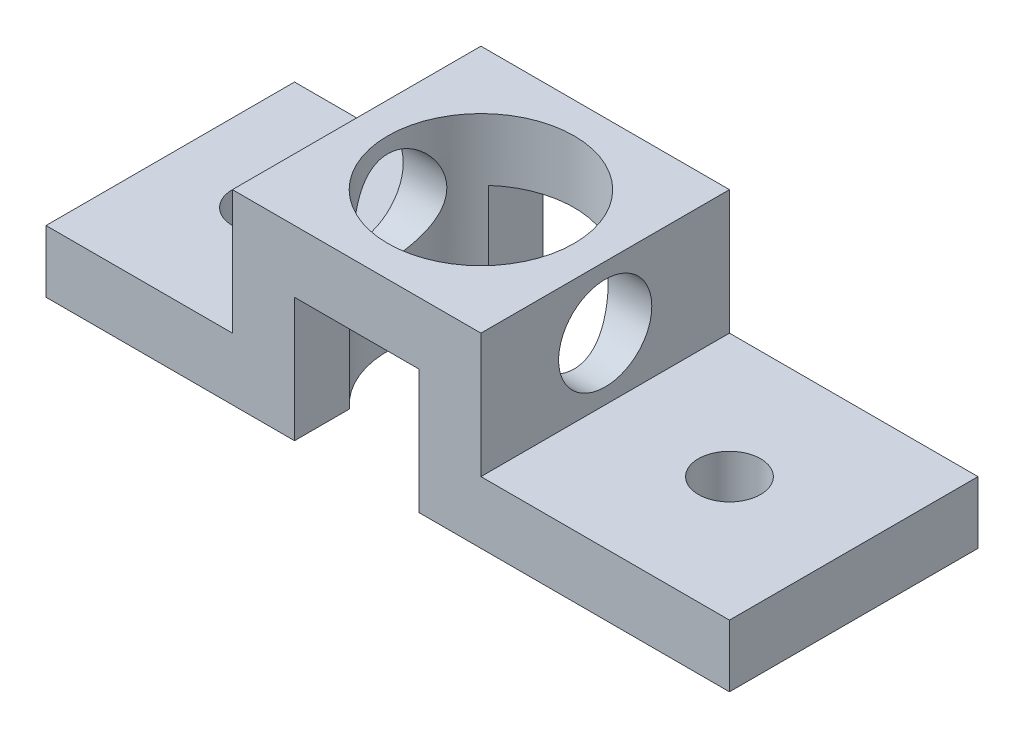
ISO-10303-21;
HEADER;
FILE_DESCRIPTION(('STEP AP214'),'2;1');
FILE_NAME('part.step','',(''),(''),'','','');
FILE_SCHEMA(('AUTOMOTIVE_DESIGN { 1 0 10303 214 1 1 1 1 }'));
ENDSEC;
DATA;
#1=APPLICATION_CONTEXT('core data for automotive mechanical design processes');
#2=APPLICATION_PROTOCOL_DEFINITION('international standard','automotive_design',2000,#1);
#3=PRODUCT_CONTEXT('',#1,'mechanical');
#4=PRODUCT('Part','Part','',(#3));
#5=PRODUCT_RELATED_PRODUCT_CATEGORY('part','',(#4));
#6=PRODUCT_DEFINITION_FORMATION('','',#4);
#7=PRODUCT_DEFINITION_CONTEXT('part definition',#1,'design');
#8=PRODUCT_DEFINITION('design','',#6,#7);
#9=PRODUCT_DEFINITION_SHAPE('','',#8);
#10=(LENGTH_UNIT() NAMED_UNIT(*) SI_UNIT(.MILLI.,.METRE.));
#11=(NAMED_UNIT(*) PLANE_ANGLE_UNIT() SI_UNIT($,.RADIAN.));
#12=(NAMED_UNIT(*) SI_UNIT($,.STERADIAN.) SOLID_ANGLE_UNIT());
#13=UNCERTAINTY_MEASURE_WITH_UNIT(LENGTH_MEASURE(1.E-05),#10,'distance_accuracy_value','');
#14=(GEOMETRIC_REPRESENTATION_CONTEXT(3) GLOBAL_UNCERTAINTY_ASSIGNED_CONTEXT((#13)) GLOBAL_UNIT_ASSIGNED_CONTEXT((#10,
#11,#12)) REPRESENTATION_CONTEXT('',''));
#15=CARTESIAN_POINT('',(0.,0.,0.));
#16=DIRECTION('',(0.,0.,1.));
#17=DIRECTION('',(1.,0.,0.));
#18=AXIS2_PLACEMENT_3D('',#15,#16,#17);
#19=CARTESIAN_POINT('',(25.4,12.7,25.4));
#20=DIRECTION('',(0.,1.,0.));
#21=DIRECTION('',(0.,0.,1.));
#22=AXIS2_PLACEMENT_3D('',#19,#20,#21);
#23=PLANE('',#22);
#24=DIRECTION('',(0.,0.,-1.));
#25=VECTOR('',#24,1.);
#26=CARTESIAN_POINT('',(38.1,12.7,25.4));
#27=LINE('',#26,#25);
#28=CARTESIAN_POINT('',(38.1,12.7,5.60048417143819));
#29=VERTEX_POINT('',#28);
#30=CARTESIAN_POINT('',(38.1,12.7,0.));
#31=VERTEX_POINT('',#30);
#32=EDGE_CURVE('E247',#29,#31,#27,.T.);
#33=ORIENTED_EDGE('',*,*,#32,.F.);
#34=CARTESIAN_POINT('',(31.75,12.7,12.7));
#35=DIRECTION('',(0.,1.,0.));
#36=DIRECTION('',(0.,0.,1.));
#37=AXIS2_PLACEMENT_3D('',#34,#35,#36);
#38=CIRCLE('',#37,9.52499999999998);
#39=CARTESIAN_POINT('',(25.4,12.7,5.60048417143818));
#40=VERTEX_POINT('',#39);
#41=EDGE_CURVE('E336',#29,#40,#38,.T.);
#42=ORIENTED_EDGE('',*,*,#41,.T.);
#43=DIRECTION('',(0.,0.,-1.));
#44=VECTOR('',#43,1.);
#45=CARTESIAN_POINT('',(25.4,12.7,25.4));
#46=LINE('',#45,#44);
#47=CARTESIAN_POINT('',(25.4,12.7,0.));
#48=VERTEX_POINT('',#47);
#49=EDGE_CURVE('E252',#40,#48,#46,.T.);
#50=ORIENTED_EDGE('',*,*,#49,.T.);
#51=DIRECTION('',(1.,0.,0.));
#52=VECTOR('',#51,1.);
#53=CARTESIAN_POINT('',(25.4,12.7,0.));
#54=LINE('',#53,#52);
#55=EDGE_CURVE('E196',#48,#31,#54,.T.);
#56=ORIENTED_EDGE('',*,*,#55,.T.);
#57=EDGE_LOOP('',(#33,#42,#50,#56));
#58=FACE_BOUND('',#57,.T.);
#59=ADVANCED_FACE('F39',(#58),#23,.F.);
#60=CARTESIAN_POINT('',(25.4,0.,25.4));
#61=DIRECTION('',(-1.,0.,0.));
#62=DIRECTION('',(0.,0.,1.));
#63=AXIS2_PLACEMENT_3D('',#60,#61,#62);
#64=PLANE('',#63);
#65=DIRECTION('',(0.,0.,-1.));
#66=VECTOR('',#65,1.);
#67=CARTESIAN_POINT('',(25.4,0.,25.4));
#68=LINE('',#67,#66);
#69=CARTESIAN_POINT('',(25.4,0.,25.4));
#70=VERTEX_POINT('',#69);
#71=CARTESIAN_POINT('',(25.4,0.,19.7995158285618));
#72=VERTEX_POINT('',#71);
#73=EDGE_CURVE('E54',#70,#72,#68,.T.);
#74=ORIENTED_EDGE('',*,*,#73,.T.);
#75=DIRECTION('',(0.,1.,0.));
#76=VECTOR('',#75,1.);
#77=CARTESIAN_POINT('',(25.4,19.05,19.7995158285618));
#78=LINE('',#77,#76);
#79=CARTESIAN_POINT('',(25.4,12.7,19.7995158285618));
#80=VERTEX_POINT('',#79);
#81=EDGE_CURVE('E188',#72,#80,#78,.T.);
#82=ORIENTED_EDGE('',*,*,#81,.T.);
#83=CARTESIAN_POINT('',(25.4,12.7,25.4));
#84=VERTEX_POINT('',#83);
#85=EDGE_CURVE('E253',#84,#80,#46,.T.);
#86=ORIENTED_EDGE('',*,*,#85,.F.);
#87=DIRECTION('',(0.,1.,0.));
#88=VECTOR('',#87,1.);
#89=CARTESIAN_POINT('',(25.4,0.,25.4));
#90=LINE('',#89,#88);
#91=EDGE_CURVE('E326',#70,#84,#90,.T.);
#92=ORIENTED_EDGE('',*,*,#91,.F.);
#93=EDGE_LOOP('',(#74,#82,#86,#92));
#94=FACE_BOUND('',#93,.T.);
#95=ADVANCED_FACE('F292',(#94),#64,.F.);
#96=CARTESIAN_POINT('',(38.1,12.7,25.4));
#97=DIRECTION('',(1.,0.,0.));
#98=DIRECTION('',(0.,0.,-1.));
#99=AXIS2_PLACEMENT_3D('',#96,#97,#98);
#100=PLANE('',#99);
#101=DIRECTION('',(0.,0.,-1.));
#102=VECTOR('',#101,1.);
#103=CARTESIAN_POINT('',(38.1,0.,25.4));
#104=LINE('',#103,#102);
#105=CARTESIAN_POINT('',(38.1,0.,5.60048417143819));
#106=VERTEX_POINT('',#105);
#107=CARTESIAN_POINT('',(38.1,0.,0.));
#108=VERTEX_POINT('',#107);
#109=EDGE_CURVE('E242',#106,#108,#104,.T.);
#110=ORIENTED_EDGE('',*,*,#109,.F.);
#111=DIRECTION('',(0.,1.,0.));
#112=VECTOR('',#111,1.);
#113=CARTESIAN_POINT('',(38.1,19.05,5.60048417143819));
#114=LINE('',#113,#112);
#115=EDGE_CURVE('E62',#106,#29,#114,.T.);
#116=ORIENTED_EDGE('',*,*,#115,.T.);
#117=ORIENTED_EDGE('',*,*,#32,.T.);
#118=DIRECTION('',(0.,-1.,0.));
#119=VECTOR('',#118,1.);
#120=CARTESIAN_POINT('',(38.1,12.7,0.));
#121=LINE('',#120,#119);
#122=EDGE_CURVE('E200',#31,#108,#121,.T.);
#123=ORIENTED_EDGE('',*,*,#122,.T.);
#124=EDGE_LOOP('',(#110,#116,#117,#123));
#125=FACE_BOUND('',#124,.T.);
#126=ADVANCED_FACE('F299',(#125),#100,.F.);
#127=CARTESIAN_POINT('',(0.,6.34999999999999,25.4));
#128=DIRECTION('',(1.,0.,0.));
#129=DIRECTION('',(0.,0.,-1.));
#130=AXIS2_PLACEMENT_3D('',#127,#128,#129);
#131=PLANE('',#130);
#132=DIRECTION('',(0.,-1.,0.));
#133=VECTOR('',#132,1.);
#134=CARTESIAN_POINT('',(0.,6.34999999999999,0.));
#135=LINE('',#134,#133);
#136=CARTESIAN_POINT('',(0.,6.34999999999999,0.));
#137=VERTEX_POINT('',#136);
#138=CARTESIAN_POINT('',(0.,0.,0.));
#139=VERTEX_POINT('',#138);
#140=EDGE_CURVE('E183',#137,#139,#135,.T.);
#141=ORIENTED_EDGE('',*,*,#140,.T.);
#142=DIRECTION('',(0.,0.,-1.));
#143=VECTOR('',#142,1.);
#144=CARTESIAN_POINT('',(0.,0.,25.4));
#145=LINE('',#144,#143);
#146=CARTESIAN_POINT('',(0.,0.,25.4));
#147=VERTEX_POINT('',#146);
#148=EDGE_CURVE('E11',#147,#139,#145,.T.);
#149=ORIENTED_EDGE('',*,*,#148,.F.);
#150=DIRECTION('',(0.,-1.,0.));
#151=VECTOR('',#150,1.);
#152=CARTESIAN_POINT('',(0.,6.34999999999999,25.4));
#153=LINE('',#152,#151);
#154=CARTESIAN_POINT('',(0.,6.34999999999999,25.4));
#155=VERTEX_POINT('',#154);
#156=EDGE_CURVE('E223',#155,#147,#153,.T.);
#157=ORIENTED_EDGE('',*,*,#156,.F.);
#158=DIRECTION('',(0.,0.,-1.));
#159=VECTOR('',#158,1.);
#160=CARTESIAN_POINT('',(0.,6.34999999999999,25.4));
#161=LINE('',#160,#159);
#162=EDGE_CURVE('E179',#155,#137,#161,.T.);
#163=ORIENTED_EDGE('',*,*,#162,.T.);
#164=EDGE_LOOP('',(#141,#149,#157,#163));
#165=FACE_BOUND('',#164,.T.);
#166=ADVANCED_FACE('F41',(#165),#131,.F.);
#167=CARTESIAN_POINT('',(0.,0.,25.4));
#168=DIRECTION('',(0.,1.,0.));
#169=DIRECTION('',(0.,0.,1.));
#170=AXIS2_PLACEMENT_3D('',#167,#168,#169);
#171=PLANE('',#170);
#172=CARTESIAN_POINT('',(9.525,0.,12.7));
#173=DIRECTION('',(0.,1.,0.));
#174=DIRECTION('',(0.,0.,1.));
#175=AXIS2_PLACEMENT_3D('',#172,#173,#174);
#176=CIRCLE('',#175,3.175);
#177=CARTESIAN_POINT('',(9.525,0.,15.875));
#178=VERTEX_POINT('',#177);
#179=EDGE_CURVE('E391',#178,#178,#176,.T.);
#180=ORIENTED_EDGE('',*,*,#179,.T.);
#181=EDGE_LOOP('',(#180));
#182=FACE_BOUND('',#181,.T.);
#183=CARTESIAN_POINT('',(25.4,0.,5.60048417143818));
#184=VERTEX_POINT('',#183);
#185=CARTESIAN_POINT('',(25.4,0.,0.));
#186=VERTEX_POINT('',#185);
#187=EDGE_CURVE('E257',#184,#186,#68,.T.);
#188=ORIENTED_EDGE('',*,*,#187,.F.);
#189=CARTESIAN_POINT('',(31.75,0.,12.7));
#190=DIRECTION('',(0.,1.,0.));
#191=DIRECTION('',(0.,0.,1.));
#192=AXIS2_PLACEMENT_3D('',#189,#190,#191);
#193=CIRCLE('',#192,9.52499999999998);
#194=EDGE_CURVE('E377',#184,#72,#193,.T.);
#195=ORIENTED_EDGE('',*,*,#194,.T.);
#196=ORIENTED_EDGE('',*,*,#73,.F.);
#197=DIRECTION('',(1.,0.,0.));
#198=VECTOR('',#197,1.);
#199=CARTESIAN_POINT('',(0.,0.,25.4));
#200=LINE('',#199,#198);
#201=EDGE_CURVE('E124',#147,#70,#200,.T.);
#202=ORIENTED_EDGE('',*,*,#201,.F.);
#203=ORIENTED_EDGE('',*,*,#148,.T.);
#204=DIRECTION('',(1.,0.,0.));
#205=VECTOR('',#204,1.);
#206=CARTESIAN_POINT('',(0.,0.,0.));
#207=LINE('',#206,#205);
#208=EDGE_CURVE('E187',#139,#186,#207,.T.);
#209=ORIENTED_EDGE('',*,*,#208,.T.);
#210=EDGE_LOOP('',(#188,#195,#196,#202,#203,#209));
#211=FACE_BOUND('',#210,.T.);
#212=ADVANCED_FACE('F314',(#182,#211),#171,.F.);
#213=ORIENTED_EDGE('',*,*,#49,.F.);
#214=DIRECTION('',(0.,1.,0.));
#215=VECTOR('',#214,1.);
#216=CARTESIAN_POINT('',(25.4,19.05,5.60048417143818));
#217=LINE('',#216,#215);
#218=EDGE_CURVE('E389',#40,#184,#217,.F.);
#219=ORIENTED_EDGE('',*,*,#218,.T.);
#220=ORIENTED_EDGE('',*,*,#187,.T.);
#221=DIRECTION('',(0.,1.,0.));
#222=VECTOR('',#221,1.);
#223=CARTESIAN_POINT('',(25.4,0.,0.));
#224=LINE('',#223,#222);
#225=EDGE_CURVE('E192',#186,#48,#224,.T.);
#226=ORIENTED_EDGE('',*,*,#225,.T.);
#227=EDGE_LOOP('',(#213,#219,#220,#226));
#228=FACE_BOUND('',#227,.T.);
#229=ADVANCED_FACE('F302',(#228),#64,.F.);
#230=ORIENTED_EDGE('',*,*,#85,.T.);
#231=CARTESIAN_POINT('',(38.1,12.7,19.7995158285618));
#232=VERTEX_POINT('',#231);
#233=EDGE_CURVE('E322',#80,#232,#38,.T.);
#234=ORIENTED_EDGE('',*,*,#233,.T.);
#235=CARTESIAN_POINT('',(38.1,12.7,25.4));
#236=VERTEX_POINT('',#235);
#237=EDGE_CURVE('E248',#236,#232,#27,.T.);
#238=ORIENTED_EDGE('',*,*,#237,.F.);
#239=DIRECTION('',(1.,0.,0.));
#240=VECTOR('',#239,1.);
#241=CARTESIAN_POINT('',(25.4,12.7,25.4));
#242=LINE('',#241,#240);
#243=EDGE_CURVE('E323',#84,#236,#242,.T.);
#244=ORIENTED_EDGE('',*,*,#243,.F.);
#245=EDGE_LOOP('',(#230,#234,#238,#244));
#246=FACE_BOUND('',#245,.T.);
#247=ADVANCED_FACE('F295',(#246),#23,.F.);
#248=ORIENTED_EDGE('',*,*,#237,.T.);
#249=DIRECTION('',(0.,1.,0.));
#250=VECTOR('',#249,1.);
#251=CARTESIAN_POINT('',(38.1,19.05,19.7995158285618));
#252=LINE('',#251,#250);
#253=CARTESIAN_POINT('',(38.1,0.,19.7995158285618));
#254=VERTEX_POINT('',#253);
#255=EDGE_CURVE('E334',#232,#254,#252,.F.);
#256=ORIENTED_EDGE('',*,*,#255,.T.);
#257=CARTESIAN_POINT('',(38.1,0.,25.4));
#258=VERTEX_POINT('',#257);
#259=EDGE_CURVE('E243',#258,#254,#104,.T.);
#260=ORIENTED_EDGE('',*,*,#259,.F.);
#261=DIRECTION('',(0.,-1.,0.));
#262=VECTOR('',#261,1.);
#263=CARTESIAN_POINT('',(38.1,12.7,25.4));
#264=LINE('',#263,#262);
#265=EDGE_CURVE('E348',#236,#258,#264,.T.);
#266=ORIENTED_EDGE('',*,*,#265,.F.);
#267=EDGE_LOOP('',(#248,#256,#260,#266));
#268=FACE_BOUND('',#267,.T.);
#269=ADVANCED_FACE('F306',(#268),#100,.F.);
#270=CARTESIAN_POINT('',(38.1,0.,25.4));
#271=DIRECTION('',(0.,1.,0.));
#272=DIRECTION('',(0.,0.,1.));
#273=AXIS2_PLACEMENT_3D('',#270,#271,#272);
#274=PLANE('',#273);
#275=CARTESIAN_POINT('',(57.15,0.,12.7));
#276=DIRECTION('',(0.,1.,0.));
#277=DIRECTION('',(0.,0.,1.));
#278=AXIS2_PLACEMENT_3D('',#275,#276,#277);
#279=CIRCLE('',#278,3.175);
#280=CARTESIAN_POINT('',(57.15,0.,15.875));
#281=VERTEX_POINT('',#280);
#282=EDGE_CURVE('E587',#281,#281,#279,.T.);
#283=ORIENTED_EDGE('',*,*,#282,.T.);
#284=EDGE_LOOP('',(#283));
#285=FACE_BOUND('',#284,.T.);
#286=ORIENTED_EDGE('',*,*,#259,.T.);
#287=EDGE_CURVE('E384',#254,#106,#193,.T.);
#288=ORIENTED_EDGE('',*,*,#287,.T.);
#289=ORIENTED_EDGE('',*,*,#109,.T.);
#290=DIRECTION('',(1.,0.,0.));
#291=VECTOR('',#290,1.);
#292=CARTESIAN_POINT('',(38.1,0.,0.));
#293=LINE('',#292,#291);
#294=CARTESIAN_POINT('',(69.85,0.,0.));
#295=VERTEX_POINT('',#294);
#296=EDGE_CURVE('E204',#108,#295,#293,.T.);
#297=ORIENTED_EDGE('',*,*,#296,.T.);
#298=DIRECTION('',(0.,0.,-1.));
#299=VECTOR('',#298,1.);
#300=CARTESIAN_POINT('',(69.85,0.,25.4));
#301=LINE('',#300,#299);
#302=CARTESIAN_POINT('',(69.85,0.,25.4));
#303=VERTEX_POINT('',#302);
#304=EDGE_CURVE('E238',#303,#295,#301,.T.);
#305=ORIENTED_EDGE('',*,*,#304,.F.);
#306=DIRECTION('',(1.,0.,0.));
#307=VECTOR('',#306,1.);
#308=CARTESIAN_POINT('',(38.1,0.,25.4));
#309=LINE('',#308,#307);
#310=EDGE_CURVE('E351',#258,#303,#309,.T.);
#311=ORIENTED_EDGE('',*,*,#310,.F.);
#312=EDGE_LOOP('',(#286,#288,#289,#297,#305,#311));
#313=FACE_BOUND('',#312,.T.);
#314=ADVANCED_FACE('F312',(#285,#313),#274,.F.);
#315=CARTESIAN_POINT('',(69.85,0.,25.4));
#316=DIRECTION('',(-1.,0.,0.));
#317=DIRECTION('',(0.,0.,1.));
#318=AXIS2_PLACEMENT_3D('',#315,#316,#317);
#319=PLANE('',#318);
#320=DIRECTION('',(0.,1.,0.));
#321=VECTOR('',#320,1.);
#322=CARTESIAN_POINT('',(69.85,0.,0.));
#323=LINE('',#322,#321);
#324=CARTESIAN_POINT('',(69.85,6.35,0.));
#325=VERTEX_POINT('',#324);
#326=EDGE_CURVE('E207',#295,#325,#323,.T.);
#327=ORIENTED_EDGE('',*,*,#326,.T.);
#328=DIRECTION('',(0.,0.,-1.));
#329=VECTOR('',#328,1.);
#330=CARTESIAN_POINT('',(69.85,6.35,25.4));
#331=LINE('',#330,#329);
#332=CARTESIAN_POINT('',(69.85,6.35,25.4));
#333=VERTEX_POINT('',#332);
#334=EDGE_CURVE('E234',#333,#325,#331,.T.);
#335=ORIENTED_EDGE('',*,*,#334,.F.);
#336=DIRECTION('',(0.,1.,0.));
#337=VECTOR('',#336,1.);
#338=CARTESIAN_POINT('',(69.85,0.,25.4));
#339=LINE('',#338,#337);
#340=EDGE_CURVE('E354',#303,#333,#339,.T.);
#341=ORIENTED_EDGE('',*,*,#340,.F.);
#342=ORIENTED_EDGE('',*,*,#304,.T.);
#343=EDGE_LOOP('',(#327,#335,#341,#342));
#344=FACE_BOUND('',#343,.T.);
#345=ADVANCED_FACE('F415',(#344),#319,.F.);
#346=CARTESIAN_POINT('',(69.85,6.35,25.4));
#347=DIRECTION('',(0.,-1.,0.));
#348=DIRECTION('',(1.,0.,0.));
#349=AXIS2_PLACEMENT_3D('',#346,#347,#348);
#350=PLANE('',#349);
#351=CARTESIAN_POINT('',(57.15,6.35,12.7));
#352=DIRECTION('',(0.,1.,0.));
#353=DIRECTION('',(0.,0.,1.));
#354=AXIS2_PLACEMENT_3D('',#351,#352,#353);
#355=CIRCLE('',#354,3.17499999999998);
#356=CARTESIAN_POINT('',(57.15,6.35,15.875));
#357=VERTEX_POINT('',#356);
#358=EDGE_CURVE('E593',#357,#357,#355,.T.);
#359=ORIENTED_EDGE('',*,*,#358,.F.);
#360=EDGE_LOOP('',(#359));
#361=FACE_BOUND('',#360,.T.);
#362=DIRECTION('',(-1.,0.,0.));
#363=VECTOR('',#362,1.);
#364=CARTESIAN_POINT('',(69.85,6.35,0.));
#365=LINE('',#364,#363);
#366=CARTESIAN_POINT('',(44.45,6.35,0.));
#367=VERTEX_POINT('',#366);
#368=EDGE_CURVE('E210',#325,#367,#365,.T.);
#369=ORIENTED_EDGE('',*,*,#368,.T.);
#370=DIRECTION('',(0.,0.,-1.));
#371=VECTOR('',#370,1.);
#372=CARTESIAN_POINT('',(44.45,6.35,25.4));
#373=LINE('',#372,#371);
#374=CARTESIAN_POINT('',(44.45,6.35,25.4));
#375=VERTEX_POINT('',#374);
#376=EDGE_CURVE('E230',#375,#367,#373,.T.);
#377=ORIENTED_EDGE('',*,*,#376,.F.);
#378=DIRECTION('',(-1.,0.,0.));
#379=VECTOR('',#378,1.);
#380=CARTESIAN_POINT('',(69.85,6.35,25.4));
#381=LINE('',#380,#379);
#382=EDGE_CURVE('E357',#333,#375,#381,.T.);
#383=ORIENTED_EDGE('',*,*,#382,.F.);
#384=ORIENTED_EDGE('',*,*,#334,.T.);
#385=EDGE_LOOP('',(#369,#377,#383,#384));
#386=FACE_BOUND('',#385,.T.);
#387=ADVANCED_FACE('F365',(#361,#386),#350,.F.);
#388=CARTESIAN_POINT('',(44.45,6.35,25.4));
#389=DIRECTION('',(-1.,0.,0.));
#390=DIRECTION('',(0.,0.,1.));
#391=AXIS2_PLACEMENT_3D('',#388,#389,#390);
#392=PLANE('',#391);
#393=CARTESIAN_POINT('',(44.45,12.7,12.7));
#394=DIRECTION('',(1.,0.,0.));
#395=DIRECTION('',(0.,0.,-1.));
#396=AXIS2_PLACEMENT_3D('',#393,#394,#395);
#397=CIRCLE('',#396,4.7625);
#398=CARTESIAN_POINT('',(44.45,12.7,7.9375));
#399=VERTEX_POINT('',#398);
#400=EDGE_CURVE('E266',#399,#399,#397,.T.);
#401=ORIENTED_EDGE('',*,*,#400,.F.);
#402=EDGE_LOOP('',(#401));
#403=FACE_BOUND('',#402,.T.);
#404=DIRECTION('',(0.,1.,0.));
#405=VECTOR('',#404,1.);
#406=CARTESIAN_POINT('',(44.45,6.35,0.));
#407=LINE('',#406,#405);
#408=CARTESIAN_POINT('',(44.45,19.05,0.));
#409=VERTEX_POINT('',#408);
#410=EDGE_CURVE('E213',#367,#409,#407,.T.);
#411=ORIENTED_EDGE('',*,*,#410,.T.);
#412=DIRECTION('',(0.,0.,-1.));
#413=VECTOR('',#412,1.);
#414=CARTESIAN_POINT('',(44.45,19.05,25.4));
#415=LINE('',#414,#413);
#416=CARTESIAN_POINT('',(44.45,19.05,25.4));
#417=VERTEX_POINT('',#416);
#418=EDGE_CURVE('E172',#417,#409,#415,.T.);
#419=ORIENTED_EDGE('',*,*,#418,.F.);
#420=DIRECTION('',(0.,1.,0.));
#421=VECTOR('',#420,1.);
#422=CARTESIAN_POINT('',(44.45,6.35,25.4));
#423=LINE('',#422,#421);
#424=EDGE_CURVE('E158',#375,#417,#423,.T.);
#425=ORIENTED_EDGE('',*,*,#424,.F.);
#426=ORIENTED_EDGE('',*,*,#376,.T.);
#427=EDGE_LOOP('',(#411,#419,#425,#426));
#428=FACE_BOUND('',#427,.T.);
#429=ADVANCED_FACE('F369',(#403,#428),#392,.F.);
#430=CARTESIAN_POINT('',(44.45,19.05,25.4));
#431=DIRECTION('',(0.,-1.,0.));
#432=DIRECTION('',(1.,0.,0.));
#433=AXIS2_PLACEMENT_3D('',#430,#431,#432);
#434=PLANE('',#433);
#435=CARTESIAN_POINT('',(31.75,19.05,12.7));
#436=DIRECTION('',(0.,1.,0.));
#437=DIRECTION('',(0.,0.,1.));
#438=AXIS2_PLACEMENT_3D('',#435,#436,#437);
#439=CIRCLE('',#438,9.52499999999998);
#440=CARTESIAN_POINT('',(31.75,19.05,22.225));
#441=VERTEX_POINT('',#440);
#442=EDGE_CURVE('E385',#441,#441,#439,.T.);
#443=ORIENTED_EDGE('',*,*,#442,.F.);
#444=EDGE_LOOP('',(#443));
#445=FACE_BOUND('',#444,.T.);
#446=DIRECTION('',(-1.,0.,0.));
#447=VECTOR('',#446,1.);
#448=CARTESIAN_POINT('',(44.45,19.05,0.));
#449=LINE('',#448,#447);
#450=CARTESIAN_POINT('',(19.05,19.05,0.));
#451=VERTEX_POINT('',#450);
#452=EDGE_CURVE('E168',#409,#451,#449,.T.);
#453=ORIENTED_EDGE('',*,*,#452,.T.);
#454=DIRECTION('',(0.,0.,-1.));
#455=VECTOR('',#454,1.);
#456=CARTESIAN_POINT('',(19.05,19.05,25.4));
#457=LINE('',#456,#455);
#458=CARTESIAN_POINT('',(19.05,19.05,25.4));
#459=VERTEX_POINT('',#458);
#460=EDGE_CURVE('E165',#459,#451,#457,.T.);
#461=ORIENTED_EDGE('',*,*,#460,.F.);
#462=DIRECTION('',(-1.,0.,0.));
#463=VECTOR('',#462,1.);
#464=CARTESIAN_POINT('',(44.45,19.05,25.4));
#465=LINE('',#464,#463);
#466=EDGE_CURVE('E151',#417,#459,#465,.T.);
#467=ORIENTED_EDGE('',*,*,#466,.F.);
#468=ORIENTED_EDGE('',*,*,#418,.T.);
#469=EDGE_LOOP('',(#453,#461,#467,#468));
#470=FACE_BOUND('',#469,.T.);
#471=ADVANCED_FACE('F166',(#445,#470),#434,.F.);
#472=CARTESIAN_POINT('',(19.05,19.05,25.4));
#473=DIRECTION('',(1.,0.,0.));
#474=DIRECTION('',(0.,1.,0.));
#475=AXIS2_PLACEMENT_3D('',#472,#473,#474);
#476=PLANE('',#475);
#477=CARTESIAN_POINT('',(19.05,12.7,12.7));
#478=DIRECTION('',(1.,0.,0.));
#479=DIRECTION('',(0.,1.,0.));
#480=AXIS2_PLACEMENT_3D('',#477,#478,#479);
#481=CIRCLE('',#480,4.7625);
#482=CARTESIAN_POINT('',(19.05,17.4625,12.7));
#483=VERTEX_POINT('',#482);
#484=EDGE_CURVE('E597',#483,#483,#481,.T.);
#485=ORIENTED_EDGE('',*,*,#484,.T.);
#486=EDGE_LOOP('',(#485));
#487=FACE_BOUND('',#486,.T.);
#488=DIRECTION('',(0.,-1.,0.));
#489=VECTOR('',#488,1.);
#490=CARTESIAN_POINT('',(19.05,19.05,0.));
#491=LINE('',#490,#489);
#492=CARTESIAN_POINT('',(19.05,6.34999999999999,0.));
#493=VERTEX_POINT('',#492);
#494=EDGE_CURVE('E218',#451,#493,#491,.T.);
#495=ORIENTED_EDGE('',*,*,#494,.T.);
#496=DIRECTION('',(0.,0.,-1.));
#497=VECTOR('',#496,1.);
#498=CARTESIAN_POINT('',(19.05,6.34999999999999,25.4));
#499=LINE('',#498,#497);
#500=CARTESIAN_POINT('',(19.05,6.34999999999999,25.4));
#501=VERTEX_POINT('',#500);
#502=EDGE_CURVE('E173',#501,#493,#499,.T.);
#503=ORIENTED_EDGE('',*,*,#502,.F.);
#504=DIRECTION('',(0.,-1.,0.));
#505=VECTOR('',#504,1.);
#506=CARTESIAN_POINT('',(19.05,19.05,25.4));
#507=LINE('',#506,#505);
#508=EDGE_CURVE('E155',#459,#501,#507,.T.);
#509=ORIENTED_EDGE('',*,*,#508,.F.);
#510=ORIENTED_EDGE('',*,*,#460,.T.);
#511=EDGE_LOOP('',(#495,#503,#509,#510));
#512=FACE_BOUND('',#511,.T.);
#513=ADVANCED_FACE('F175',(#487,#512),#476,.F.);
#514=CARTESIAN_POINT('',(19.05,6.34999999999999,25.4));
#515=DIRECTION('',(0.,-1.,0.));
#516=DIRECTION('',(1.,0.,0.));
#517=AXIS2_PLACEMENT_3D('',#514,#515,#516);
#518=PLANE('',#517);
#519=CARTESIAN_POINT('',(9.525,6.34999999999999,12.7));
#520=DIRECTION('',(0.,1.,0.));
#521=DIRECTION('',(0.,0.,1.));
#522=AXIS2_PLACEMENT_3D('',#519,#520,#521);
#523=CIRCLE('',#522,3.175);
#524=CARTESIAN_POINT('',(9.525,6.34999999999999,15.875));
#525=VERTEX_POINT('',#524);
#526=EDGE_CURVE('E584',#525,#525,#523,.T.);
#527=ORIENTED_EDGE('',*,*,#526,.F.);
#528=EDGE_LOOP('',(#527));
#529=FACE_BOUND('',#528,.T.);
#530=DIRECTION('',(-1.,0.,0.));
#531=VECTOR('',#530,1.);
#532=CARTESIAN_POINT('',(19.05,6.34999999999999,0.));
#533=LINE('',#532,#531);
#534=EDGE_CURVE('E116',#493,#137,#533,.T.);
#535=ORIENTED_EDGE('',*,*,#534,.T.);
#536=ORIENTED_EDGE('',*,*,#162,.F.);
#537=DIRECTION('',(-1.,0.,0.));
#538=VECTOR('',#537,1.);
#539=CARTESIAN_POINT('',(19.05,6.34999999999999,25.4));
#540=LINE('',#539,#538);
#541=EDGE_CURVE('E71',#501,#155,#540,.T.);
#542=ORIENTED_EDGE('',*,*,#541,.F.);
#543=ORIENTED_EDGE('',*,*,#502,.T.);
#544=EDGE_LOOP('',(#535,#536,#542,#543));
#545=FACE_BOUND('',#544,.T.);
#546=ADVANCED_FACE('F372',(#529,#545),#518,.F.);
#547=CARTESIAN_POINT('',(0.,0.,25.4));
#548=DIRECTION('',(0.,0.,1.));
#549=DIRECTION('',(1.,0.,0.));
#550=AXIS2_PLACEMENT_3D('',#547,#548,#549);
#551=PLANE('',#550);
#552=ORIENTED_EDGE('',*,*,#156,.T.);
#553=ORIENTED_EDGE('',*,*,#201,.T.);
#554=ORIENTED_EDGE('',*,*,#91,.T.);
#555=ORIENTED_EDGE('',*,*,#243,.T.);
#556=ORIENTED_EDGE('',*,*,#265,.T.);
#557=ORIENTED_EDGE('',*,*,#310,.T.);
#558=ORIENTED_EDGE('',*,*,#340,.T.);
#559=ORIENTED_EDGE('',*,*,#382,.T.);
#560=ORIENTED_EDGE('',*,*,#424,.T.);
#561=ORIENTED_EDGE('',*,*,#466,.T.);
#562=ORIENTED_EDGE('',*,*,#508,.T.);
#563=ORIENTED_EDGE('',*,*,#541,.T.);
#564=EDGE_LOOP('',(#552,#553,#554,#555,#556,#557,#558,#559,#560,#561,#562,#563));
#565=FACE_BOUND('',#564,.T.);
#566=ADVANCED_FACE('F153',(#565),#551,.T.);
#567=CARTESIAN_POINT('',(0.,0.,0.));
#568=DIRECTION('',(0.,0.,1.));
#569=DIRECTION('',(1.,0.,0.));
#570=AXIS2_PLACEMENT_3D('',#567,#568,#569);
#571=PLANE('',#570);
#572=ORIENTED_EDGE('',*,*,#140,.F.);
#573=ORIENTED_EDGE('',*,*,#534,.F.);
#574=ORIENTED_EDGE('',*,*,#494,.F.);
#575=ORIENTED_EDGE('',*,*,#452,.F.);
#576=ORIENTED_EDGE('',*,*,#410,.F.);
#577=ORIENTED_EDGE('',*,*,#368,.F.);
#578=ORIENTED_EDGE('',*,*,#326,.F.);
#579=ORIENTED_EDGE('',*,*,#296,.F.);
#580=ORIENTED_EDGE('',*,*,#122,.F.);
#581=ORIENTED_EDGE('',*,*,#55,.F.);
#582=ORIENTED_EDGE('',*,*,#225,.F.);
#583=ORIENTED_EDGE('',*,*,#208,.F.);
#584=EDGE_LOOP('',(#572,#573,#574,#575,#576,#577,#578,#579,#580,#581,#582,#583));
#585=FACE_BOUND('',#584,.T.);
#586=ADVANCED_FACE('F287',(#585),#571,.F.);
#587=CARTESIAN_POINT('',(31.75,19.05,12.7));
#588=DIRECTION('',(0.,1.,0.));
#589=DIRECTION('',(0.,0.,1.));
#590=AXIS2_PLACEMENT_3D('',#587,#588,#589);
#591=CYLINDRICAL_SURFACE('',#590,9.52499999999998);
#592=CARTESIAN_POINT('',(23.5011080289532,12.7,7.9375));
#593=CARTESIAN_POINT('',(23.5011072760584,12.5758590969018,7.93750059270072));
#594=CARTESIAN_POINT('',(23.4982959104718,12.4517071497996,7.94236056940463));
#595=CARTESIAN_POINT('',(23.4871556966016,12.2043616546142,7.96173550391252));
#596=CARTESIAN_POINT('',(23.4788242796528,12.0811685797408,7.97625495660781));
#597=CARTESIAN_POINT('',(23.456935759554,11.8365458554706,8.01478896298264));
#598=CARTESIAN_POINT('',(23.4433704621329,11.7151192826448,8.03881840722765));
#599=CARTESIAN_POINT('',(23.4115057591651,11.4750683650749,8.09606667771969));
#600=CARTESIAN_POINT('',(23.3932042952167,11.3564452632817,8.12928949996891));
#601=CARTESIAN_POINT('',(23.3323224243632,11.0073015748237,8.24179073494907));
#602=CARTESIAN_POINT('',(23.2836096336891,10.7819199645013,8.33415772292422));
#603=CARTESIAN_POINT('',(23.1754648890551,10.3500282380635,8.55059954010827));
#604=CARTESIAN_POINT('',(23.1160323552534,10.1435191436925,8.67467608467046));
#605=CARTESIAN_POINT('',(22.9871520873609,9.73628613659555,8.96301341686578));
#606=CARTESIAN_POINT('',(22.9172826165617,9.53744417533754,9.12974447399474));
#607=CARTESIAN_POINT('',(22.7787756682127,9.16901672839978,9.49366646385046));
#608=CARTESIAN_POINT('',(22.7101388203937,8.99944583619451,9.69087249795262));
#609=CARTESIAN_POINT('',(22.6109106795192,8.7650068266763,10.0136337095569));
#610=CARTESIAN_POINT('',(22.5774863935068,8.68815272262337,10.129791219929));
#611=CARTESIAN_POINT('',(22.5137965075357,8.54459619618498,10.3690216999685));
#612=CARTESIAN_POINT('',(22.4835296518834,8.47788973326156,10.492091890311));
#613=CARTESIAN_POINT('',(22.4270298178888,8.35528913969328,10.7443518433157));
#614=CARTESIAN_POINT('',(22.4007958007625,8.29939222375046,10.8735400188463));
#615=CARTESIAN_POINT('',(22.3531375164727,8.19902695742378,11.1371408861675));
#616=CARTESIAN_POINT('',(22.3317127384628,8.15455739313231,11.2715530212782));
#617=CARTESIAN_POINT('',(22.2956720715046,8.08036022432027,11.5348025914108));
#618=CARTESIAN_POINT('',(22.2806803331173,8.0498091705922,11.6633567470313));
#619=CARTESIAN_POINT('',(22.2558460306446,7.99944447674813,11.9230369977127));
#620=CARTESIAN_POINT('',(22.2460029652304,7.9796297912202,12.0541628410768));
#621=CARTESIAN_POINT('',(22.2317541752401,7.95100653437547,12.317840754406));
#622=CARTESIAN_POINT('',(22.2273458260388,7.94219265033983,12.4503921047172));
#623=CARTESIAN_POINT('',(22.2240886357764,7.9356765974385,12.715832494652));
#624=CARTESIAN_POINT('',(22.2252394545767,7.93797374874243,12.848721513118));
#625=CARTESIAN_POINT('',(22.2327222688001,7.95295964907163,13.1021057644723));
#626=CARTESIAN_POINT('',(22.2385933919723,7.96472413588205,13.2226706210457));
#627=CARTESIAN_POINT('',(22.2547931032615,7.99734802377998,13.4622975040843));
#628=CARTESIAN_POINT('',(22.2651230991102,8.01821029719393,13.5813590437016));
#629=CARTESIAN_POINT('',(22.2899915778414,8.0687985131175,13.8170953858544));
#630=CARTESIAN_POINT('',(22.3045286501502,8.09852148485969,13.9337709743506));
#631=CARTESIAN_POINT('',(22.3374696999661,8.16652634123396,14.1640566327309));
#632=CARTESIAN_POINT('',(22.355875163125,8.20481151453427,14.2776655058751));
#633=CARTESIAN_POINT('',(22.4168409067289,8.3331442489874,14.615861739803));
#634=CARTESIAN_POINT('',(22.4648145249163,8.43600893346705,14.8347689142178));
#635=CARTESIAN_POINT('',(22.5708735585545,8.67219153197879,15.252627546107));
#636=CARTESIAN_POINT('',(22.6289625923967,8.80552034869907,15.4515718223646));
#637=CARTESIAN_POINT('',(22.7562820507292,9.1133264592419,15.844060305798));
#638=CARTESIAN_POINT('',(22.826046591451,9.29050206130806,16.0353164061975));
#639=CARTESIAN_POINT('',(22.9653726663672,9.67389720537297,16.3866967080199));
#640=CARTESIAN_POINT('',(23.0349340041901,9.88013888492746,16.5467969568971));
#641=CARTESIAN_POINT('',(23.1356770702714,10.2151135248815,16.7652272398046));
#642=CARTESIAN_POINT('',(23.1695954436999,10.334994477451,16.8361389827047));
#643=CARTESIAN_POINT('',(23.2341604992219,10.5811806073308,16.9674875647323));
#644=CARTESIAN_POINT('',(23.2648086505256,10.7074828617701,17.0279291154694));
#645=CARTESIAN_POINT('',(23.321709353882,10.9657225092646,17.1377212764641));
#646=CARTESIAN_POINT('',(23.347963448651,11.0976579040663,17.1870757813817));
#647=CARTESIAN_POINT('',(23.3950149249747,11.3662053825654,17.2740900497137));
#648=CARTESIAN_POINT('',(23.415815675063,11.5028145200478,17.3117570351662));
#649=CARTESIAN_POINT('',(23.4496689425973,11.7687251064498,17.3723910716161));
#650=CARTESIAN_POINT('',(23.4632026839014,11.8977546942039,17.3962822417803));
#651=CARTESIAN_POINT('',(23.4843202702955,12.1577672095106,17.4333520914022));
#652=CARTESIAN_POINT('',(23.4919072095009,12.2887490850902,17.4465363417889));
#653=CARTESIAN_POINT('',(23.5008164038772,12.5515199908754,17.462003309231));
#654=CARTESIAN_POINT('',(23.5021409917784,12.683308702214,17.4642900856056));
#655=CARTESIAN_POINT('',(23.4984741887207,12.9465269161829,17.4579365756653));
#656=CARTESIAN_POINT('',(23.493483224087,13.0779564424594,17.4492970269211));
#657=CARTESIAN_POINT('',(23.478285185077,13.3249235335336,17.4227705781631));
#658=CARTESIAN_POINT('',(23.4687107501871,13.4406220514089,17.4060027358946));
#659=CARTESIAN_POINT('',(23.4450525879684,13.67004203488,17.3641228446598));
#660=CARTESIAN_POINT('',(23.4309674438236,13.7837628674355,17.3390081738568));
#661=CARTESIAN_POINT('',(23.3825769891932,14.12085381483,17.25152408813));
#662=CARTESIAN_POINT('',(23.342125769627,14.3403138630672,17.1769968365042));
#663=CARTESIAN_POINT('',(23.2472111737723,14.7736813068859,16.9940914056922));
#664=CARTESIAN_POINT('',(23.1921855932899,14.986860766557,16.8843052818116));
#665=CARTESIAN_POINT('',(23.0748147061499,15.3930392026927,16.635191088358));
#666=CARTESIAN_POINT('',(23.01246564671,15.5860277360791,16.4958478430495));
#667=CARTESIAN_POINT('',(22.8780359453029,15.9717340619561,16.1710976585416));
#668=CARTESIAN_POINT('',(22.8057193059739,16.1613511708933,15.9820983068425));
#669=CARTESIAN_POINT('',(22.6662742278416,16.5072210496743,15.5736699470753));
#670=CARTESIAN_POINT('',(22.5991475464303,16.6634625493693,15.3542307013058));
#671=CARTESIAN_POINT('',(22.5067550377017,16.8710065237566,15.0028980620773));
#672=CARTESIAN_POINT('',(22.4770036747365,16.9363981500597,14.880308409199));
#673=CARTESIAN_POINT('',(22.4215225495697,17.056503084002,14.6291530404462));
#674=CARTESIAN_POINT('',(22.3957910071557,17.1112211212174,14.5005900028516));
#675=CARTESIAN_POINT('',(22.3491208462901,17.2093425578049,14.2384470826075));
#676=CARTESIAN_POINT('',(22.3281799422584,17.2527513541146,14.1048696278604));
#677=CARTESIAN_POINT('',(22.2917217803379,17.3277298949067,13.833710494672));
#678=CARTESIAN_POINT('',(22.2762038793203,17.3593010432804,13.6961292931437));
#679=CARTESIAN_POINT('',(22.2522421492319,17.4078217695269,13.4309498732028));
#680=CARTESIAN_POINT('',(22.2432797549086,17.4258474215171,13.303594424498));
#681=CARTESIAN_POINT('',(22.2304818463404,17.4515400141555,13.0475903076803));
#682=CARTESIAN_POINT('',(22.2266459359788,17.4592077551467,12.9189417402589));
#683=CARTESIAN_POINT('',(22.2242080408783,17.4640841762651,12.6614350605577));
#684=CARTESIAN_POINT('',(22.2256045328924,17.4612959003281,12.5325770201766));
#685=CARTESIAN_POINT('',(22.2335883756404,17.4453049482656,12.2756753093866));
#686=CARTESIAN_POINT('',(22.2401755834741,17.4321025588401,12.1476316166566));
#687=CARTESIAN_POINT('',(22.2577577043432,17.396665410355,11.9018009881385));
#688=CARTESIAN_POINT('',(22.2684319971814,17.3750863753989,11.7838961507424));
#689=CARTESIAN_POINT('',(22.293891296147,17.3232319693504,11.5504560155192));
#690=CARTESIAN_POINT('',(22.3086776112223,17.2929538290378,11.4349214848088));
#691=CARTESIAN_POINT('',(22.3587186615398,17.1895056473315,11.0930411894498));
#692=CARTESIAN_POINT('',(22.3996711873092,17.1036914163555,10.8712112939598));
#693=CARTESIAN_POINT('',(22.4952296532045,16.8970557838121,10.4357599911158));
#694=CARTESIAN_POINT('',(22.5503446402942,16.7748940929096,10.2228954583323));
#695=CARTESIAN_POINT('',(22.6684776247177,16.5006747343117,9.81976932185363));
#696=CARTESIAN_POINT('',(22.7314992470366,16.348603335527,9.62951816421435));
#697=CARTESIAN_POINT('',(22.8665727725854,16.0013886495207,9.25712408708553));
#698=CARTESIAN_POINT('',(22.9388991879944,15.8034649955475,9.07767240003909));
#699=CARTESIAN_POINT('',(23.0792551398619,15.3790995620519,8.75347220450442));
#700=CARTESIAN_POINT('',(23.1472808359779,15.1526328202442,8.60875439815514));
#701=CARTESIAN_POINT('',(23.2409242027054,14.7914807674514,8.41905917058496));
#702=CARTESIAN_POINT('',(23.2711431470893,14.665363422381,8.35968911719656));
#703=CARTESIAN_POINT('',(23.3271570647556,14.407589170762,8.25196380971153));
#704=CARTESIAN_POINT('',(23.3529543148468,14.2759351588988,8.20360288258538));
#705=CARTESIAN_POINT('',(23.3990322036958,14.0083464997363,8.11859207362149));
#706=CARTESIAN_POINT('',(23.419327013981,13.8724238745861,8.0819120641794));
#707=CARTESIAN_POINT('',(23.4535841750273,13.5971672323918,8.02064647705117));
#708=CARTESIAN_POINT('',(23.4675509526836,13.457835672277,7.99605244336902));
#709=CARTESIAN_POINT('',(23.4856571709143,13.2153045126998,7.96433851599042));
#710=CARTESIAN_POINT('',(23.4914371472148,13.112599934044,7.95428371834142));
#711=CARTESIAN_POINT('',(23.49916301774,12.906599478867,7.9408639899702));
#712=CARTESIAN_POINT('',(23.5011086554729,12.8033035632528,7.93749950678548));
#713=CARTESIAN_POINT('',(23.5011080289532,12.7,7.9375));
#714=B_SPLINE_CURVE_WITH_KNOTS('',3,(#592,#593,#594,#595,#596,#597,#598,#599,#600,#601,#602,
#603,#604,#605,#606,#607,#608,#609,#610,#611,#612,#613,#614,#615,#616,#617,#618,#619,#620,#621,
#622,#623,#624,#625,#626,#627,#628,#629,#630,#631,#632,#633,#634,#635,#636,#637,#638,#639,#640,
#641,#642,#643,#644,#645,#646,#647,#648,#649,#650,#651,#652,#653,#654,#655,#656,#657,#658,#659,
#660,#661,#662,#663,#664,#665,#666,#667,#668,#669,#670,#671,#672,#673,#674,#675,#676,#677,#678,
#679,#680,#681,#682,#683,#684,#685,#686,#687,#688,#689,#690,#691,#692,#693,#694,#695,#696,#697,
#698,#699,#700,#701,#702,#703,#704,#705,#706,#707,#708,#709,#710,#711,#712,#713),.UNSPECIFIED.,
.T.,.F.,(4,2,2,2,2,2,2,2,2,2,2,2,2,2,2,2,2,2,2,2,2,2,2,2,2,2,2,2,2,2,2,2,2,2,2,2,2,2,2,2,2,2,2,
2,2,2,2,2,2,2,2,2,2,2,2,2,2,2,2,2,4),(0.,0.372315471290054,0.744804315259268,1.11787871748514,
1.49111553598561,2.23280682202776,2.97453823893684,3.77744614727716,4.58075320689749,
5.00998800301853,5.43905143864814,5.86800416968259,6.29691131496348,6.69531812541002,
7.09368613557448,7.4918616836556,7.89001286961349,8.25342137640536,8.61694470062129,
8.98034628149851,9.34388768226029,10.0802760151874,10.8169283051732,11.6232144167404,
12.4301179713144,12.8597106878863,13.289109581744,13.7183573995584,14.1473394427285,
14.5425345752374,14.9375239513556,15.3323661820562,15.7271817607473,16.0786628916725,
16.4302545314545,17.1329551681528,17.8682015372252,18.603826327115,19.432180208912,
20.2608133654721,20.6865967300835,21.1121909950173,21.5375817864788,21.9629221125511,
22.3492223853007,22.7354928073989,23.1216507879208,23.5077981379075,23.8683853074205,
24.2290873914766,24.9498683654814,25.7014774099866,26.4534323155185,27.2802219250812,
28.1077396849722,28.5351353836894,28.9623103432981,29.388374431565,29.8141399966485,
30.1239407256422,30.4337621775449),.UNSPECIFIED.);
#715=CARTESIAN_POINT('',(23.5011080289532,12.7,7.9375));
#716=VERTEX_POINT('',#715);
#717=EDGE_CURVE('E43',#716,#716,#714,.T.);
#718=ORIENTED_EDGE('',*,*,#717,.T.);
#719=EDGE_LOOP('',(#718));
#720=FACE_BOUND('',#719,.T.);
#721=CARTESIAN_POINT('',(39.9988919710468,12.7,7.9375));
#722=CARTESIAN_POINT('',(39.9988927239416,12.8241409030982,7.93750059270072));
#723=CARTESIAN_POINT('',(40.0017040895282,12.9482928502004,7.94236056940463));
#724=CARTESIAN_POINT('',(40.0128443033984,13.1956383453858,7.96173550391252));
#725=CARTESIAN_POINT('',(40.0211757203472,13.3188314202592,7.97625495660781));
#726=CARTESIAN_POINT('',(40.043064240446,13.5634541445294,8.01478896298264));
#727=CARTESIAN_POINT('',(40.0566295378671,13.6848807173552,8.03881840722765));
#728=CARTESIAN_POINT('',(40.0884942408348,13.9249316349251,8.09606667771969));
#729=CARTESIAN_POINT('',(40.1067957047832,14.0435547367183,8.12928949996891));
#730=CARTESIAN_POINT('',(40.1676775756368,14.3926984251763,8.24179073494907));
#731=CARTESIAN_POINT('',(40.2163903663108,14.6180800354987,8.33415772292422));
#732=CARTESIAN_POINT('',(40.3245351109449,15.0499717619365,8.55059954010827));
#733=CARTESIAN_POINT('',(40.3839676447465,15.2564808563075,8.67467608467046));
#734=CARTESIAN_POINT('',(40.5128479126391,15.6637138634044,8.96301341686578));
#735=CARTESIAN_POINT('',(40.5827173834383,15.8625558246625,9.12974447399474));
#736=CARTESIAN_POINT('',(40.7212243317873,16.2309832716002,9.49366646385046));
#737=CARTESIAN_POINT('',(40.7898611796062,16.4005541638055,9.69087249795262));
#738=CARTESIAN_POINT('',(40.8890893204807,16.6349931733237,10.0136337095568));
#739=CARTESIAN_POINT('',(40.9225136064931,16.7118472773766,10.129791219929));
#740=CARTESIAN_POINT('',(40.9862034924642,16.855403803815,10.3690216999685));
#741=CARTESIAN_POINT('',(41.0164703481166,16.9221102667384,10.492091890311));
#742=CARTESIAN_POINT('',(41.0729701821112,17.0447108603067,10.7443518433157));
#743=CARTESIAN_POINT('',(41.0992041992375,17.1006077762495,10.8735400188463));
#744=CARTESIAN_POINT('',(41.1468624835272,17.2009730425762,11.1371408861675));
#745=CARTESIAN_POINT('',(41.1682872615372,17.2454426068677,11.2715530212782));
#746=CARTESIAN_POINT('',(41.2043279284954,17.3196397756797,11.5348025914108));
#747=CARTESIAN_POINT('',(41.2193196668827,17.3501908294078,11.6633567470313));
#748=CARTESIAN_POINT('',(41.2441539693554,17.4005555232519,11.9230369977127));
#749=CARTESIAN_POINT('',(41.2539970347696,17.4203702087798,12.0541628410768));
#750=CARTESIAN_POINT('',(41.2682458247599,17.4489934656245,12.317840754406));
#751=CARTESIAN_POINT('',(41.2726541739612,17.4578073496602,12.4503921047172));
#752=CARTESIAN_POINT('',(41.2759113642236,17.4643234025615,12.715832494652));
#753=CARTESIAN_POINT('',(41.2747605454232,17.4620262512576,12.848721513118));
#754=CARTESIAN_POINT('',(41.2672777311999,17.4470403509284,13.1021057644723));
#755=CARTESIAN_POINT('',(41.2614066080277,17.4352758641179,13.2226706210457));
#756=CARTESIAN_POINT('',(41.2452068967384,17.40265197622,13.4622975040843));
#757=CARTESIAN_POINT('',(41.2348769008898,17.3817897028061,13.5813590437016));
#758=CARTESIAN_POINT('',(41.2100084221586,17.3312014868825,13.8170953858544));
#759=CARTESIAN_POINT('',(41.1954713498497,17.3014785151403,13.9337709743506));
#760=CARTESIAN_POINT('',(41.1625303000338,17.233473658766,14.1640566327308));
#761=CARTESIAN_POINT('',(41.144124836875,17.1951884854657,14.2776655058751));
#762=CARTESIAN_POINT('',(41.0831590932711,17.0668557510126,14.615861739803));
#763=CARTESIAN_POINT('',(41.0351854750837,16.963991066533,14.8347689142178));
#764=CARTESIAN_POINT('',(40.9291264414455,16.7278084680212,15.252627546107));
#765=CARTESIAN_POINT('',(40.8710374076033,16.5944796513009,15.4515718223646));
#766=CARTESIAN_POINT('',(40.7437179492708,16.2866735407581,15.844060305798));
#767=CARTESIAN_POINT('',(40.673953408549,16.1094979386919,16.0353164061975));
#768=CARTESIAN_POINT('',(40.5346273336327,15.726102794627,16.3866967080199));
#769=CARTESIAN_POINT('',(40.4650659958098,15.5198611150725,16.5467969568971));
#770=CARTESIAN_POINT('',(40.3643229297285,15.1848864751185,16.7652272398046));
#771=CARTESIAN_POINT('',(40.3304045563001,15.065005522549,16.8361389827047));
#772=CARTESIAN_POINT('',(40.2658395007781,14.8188193926692,16.9674875647323));
#773=CARTESIAN_POINT('',(40.2351913494744,14.6925171382299,17.0279291154694));
#774=CARTESIAN_POINT('',(40.178290646118,14.4342774907354,17.1377212764641));
#775=CARTESIAN_POINT('',(40.1520365513489,14.3023420959337,17.1870757813817));
#776=CARTESIAN_POINT('',(40.1049850750253,14.0337946174346,17.2740900497137));
#777=CARTESIAN_POINT('',(40.084184324937,13.8971854799522,17.3117570351662));
#778=CARTESIAN_POINT('',(40.0503310574027,13.6312748935502,17.3723910716161));
#779=CARTESIAN_POINT('',(40.0367973160986,13.5022453057961,17.3962822417803));
#780=CARTESIAN_POINT('',(40.0156797297045,13.2422327904894,17.4333520914022));
#781=CARTESIAN_POINT('',(40.008092790499,13.1112509149098,17.4465363417889));
#782=CARTESIAN_POINT('',(39.9991835961227,12.8484800091246,17.462003309231));
#783=CARTESIAN_POINT('',(39.9978590082216,12.716691297786,17.4642900856056));
#784=CARTESIAN_POINT('',(40.0015258112793,12.4534730838171,17.4579365756653));
#785=CARTESIAN_POINT('',(40.006516775913,12.3220435575406,17.4492970269211));
#786=CARTESIAN_POINT('',(40.021714814923,12.0750764664664,17.4227705781631));
#787=CARTESIAN_POINT('',(40.0312892498129,11.9593779485911,17.4060027358946));
#788=CARTESIAN_POINT('',(40.0549474120316,11.72995796512,17.3641228446598));
#789=CARTESIAN_POINT('',(40.0690325561764,11.6162371325645,17.3390081738568));
#790=CARTESIAN_POINT('',(40.1174230108068,11.27914618517,17.25152408813));
#791=CARTESIAN_POINT('',(40.157874230373,11.0596861369328,17.1769968365042));
#792=CARTESIAN_POINT('',(40.2527888262277,10.6263186931141,16.9940914056922));
#793=CARTESIAN_POINT('',(40.3078144067101,10.413139233443,16.8843052818116));
#794=CARTESIAN_POINT('',(40.4251852938501,10.0069607973073,16.635191088358));
#795=CARTESIAN_POINT('',(40.4875343532899,9.81397226392092,16.4958478430495));
#796=CARTESIAN_POINT('',(40.6219640546971,9.42826593804389,16.1710976585416));
#797=CARTESIAN_POINT('',(40.6942806940261,9.23864882910665,15.9820983068425));
#798=CARTESIAN_POINT('',(40.8337257721584,8.89277895032568,15.5736699470753));
#799=CARTESIAN_POINT('',(40.9008524535696,8.73653745063071,15.3542307013058));
#800=CARTESIAN_POINT('',(40.9932449622983,8.52899347624342,15.0028980620773));
#801=CARTESIAN_POINT('',(41.0229963252635,8.46360184994034,14.8803084091991));
#802=CARTESIAN_POINT('',(41.0784774504303,8.34349691599797,14.6291530404462));
#803=CARTESIAN_POINT('',(41.1042089928442,8.28877887878262,14.5005900028516));
#804=CARTESIAN_POINT('',(41.1508791537099,8.19065744219515,14.2384470826075));
#805=CARTESIAN_POINT('',(41.1718200577416,8.14724864588536,14.1048696278604));
#806=CARTESIAN_POINT('',(41.2082782196621,8.07227010509329,13.833710494672));
#807=CARTESIAN_POINT('',(41.2237961206797,8.04069895671961,13.6961292931437));
#808=CARTESIAN_POINT('',(41.247757850768,7.99217823047312,13.4309498732028));
#809=CARTESIAN_POINT('',(41.2567202450914,7.97415257848287,13.303594424498));
#810=CARTESIAN_POINT('',(41.2695181536596,7.94845998584446,13.0475903076803));
#811=CARTESIAN_POINT('',(41.2733540640212,7.94079224485335,12.9189417402589));
#812=CARTESIAN_POINT('',(41.2757919591216,7.9359158237349,12.6614350605577));
#813=CARTESIAN_POINT('',(41.2743954671076,7.93870409967189,12.5325770201766));
#814=CARTESIAN_POINT('',(41.2664116243596,7.95469505173435,12.2756753093866));
#815=CARTESIAN_POINT('',(41.2598244165258,7.9678974411599,12.1476316166566));
#816=CARTESIAN_POINT('',(41.2422422956568,8.00333458964499,11.9018009881385));
#817=CARTESIAN_POINT('',(41.2315680028186,8.02491362460108,11.7838961507424));
#818=CARTESIAN_POINT('',(41.206108703853,8.07676803064964,11.5504560155192));
#819=CARTESIAN_POINT('',(41.1913223887776,8.10704617096219,11.4349214848088));
#820=CARTESIAN_POINT('',(41.1412813384602,8.21049435266846,11.0930411894498));
#821=CARTESIAN_POINT('',(41.1003288126907,8.29630858364453,10.8712112939598));
#822=CARTESIAN_POINT('',(41.0047703467955,8.50294421618787,10.4357599911158));
#823=CARTESIAN_POINT('',(40.9496553597058,8.62510590709043,10.2228954583323));
#824=CARTESIAN_POINT('',(40.8315223752823,8.8993252656883,9.81976932185364));
#825=CARTESIAN_POINT('',(40.7685007529634,9.05139666447302,9.62951816421435));
#826=CARTESIAN_POINT('',(40.6334272274146,9.39861135047926,9.25712408708553));
#827=CARTESIAN_POINT('',(40.5611008120055,9.59653500445247,9.07767240003909));
#828=CARTESIAN_POINT('',(40.420744860138,10.0209004379481,8.75347220450442));
#829=CARTESIAN_POINT('',(40.3527191640221,10.2473671797558,8.60875439815514));
#830=CARTESIAN_POINT('',(40.2590757972945,10.6085192325485,8.41905917058496));
#831=CARTESIAN_POINT('',(40.2288568529107,10.734636577619,8.35968911719656));
#832=CARTESIAN_POINT('',(40.1728429352444,10.992410829238,8.25196380971154));
#833=CARTESIAN_POINT('',(40.1470456851532,11.1240648411012,8.20360288258538));
#834=CARTESIAN_POINT('',(40.1009677963041,11.3916535002637,8.11859207362149));
#835=CARTESIAN_POINT('',(40.0806729860189,11.5275761254139,8.0819120641794));
#836=CARTESIAN_POINT('',(40.0464158249727,11.8028327676082,8.02064647705117));
#837=CARTESIAN_POINT('',(40.0324490473164,11.942164327723,7.99605244336902));
#838=CARTESIAN_POINT('',(40.0143428290857,12.1846954873002,7.96433851599042));
#839=CARTESIAN_POINT('',(40.0085628527852,12.287400065956,7.95428371834142));
#840=CARTESIAN_POINT('',(40.00083698226,12.493400521133,7.9408639899702));
#841=CARTESIAN_POINT('',(39.998891344527,12.5966964367472,7.93749950678548));
#842=CARTESIAN_POINT('',(39.9988919710468,12.7,7.9375));
#843=B_SPLINE_CURVE_WITH_KNOTS('',3,(#721,#722,#723,#724,#725,#726,#727,#728,#729,#730,#731,
#732,#733,#734,#735,#736,#737,#738,#739,#740,#741,#742,#743,#744,#745,#746,#747,#748,#749,#750,
#751,#752,#753,#754,#755,#756,#757,#758,#759,#760,#761,#762,#763,#764,#765,#766,#767,#768,#769,
#770,#771,#772,#773,#774,#775,#776,#777,#778,#779,#780,#781,#782,#783,#784,#785,#786,#787,#788,
#789,#790,#791,#792,#793,#794,#795,#796,#797,#798,#799,#800,#801,#802,#803,#804,#805,#806,#807,
#808,#809,#810,#811,#812,#813,#814,#815,#816,#817,#818,#819,#820,#821,#822,#823,#824,#825,#826,
#827,#828,#829,#830,#831,#832,#833,#834,#835,#836,#837,#838,#839,#840,#841,#842),.UNSPECIFIED.,
.T.,.F.,(4,2,2,2,2,2,2,2,2,2,2,2,2,2,2,2,2,2,2,2,2,2,2,2,2,2,2,2,2,2,2,2,2,2,2,2,2,2,2,2,2,2,2,
2,2,2,2,2,2,2,2,2,2,2,2,2,2,2,2,2,4),(0.,0.372315471290052,0.744804315259267,1.11787871748514,
1.49111553598561,2.23280682202777,2.97453823893684,3.77744614727715,4.58075320689748,
5.00998800301852,5.43905143864814,5.86800416968259,6.29691131496348,6.69531812541002,
7.09368613557448,7.4918616836556,7.89001286961349,8.25342137640537,8.61694470062128,
8.98034628149851,9.34388768226029,10.0802760151874,10.8169283051732,11.6232144167404,
12.4301179713144,12.8597106878863,13.289109581744,13.7183573995584,14.1473394427285,
14.5425345752374,14.9375239513556,15.3323661820562,15.7271817607473,16.0786628916725,
16.4302545314545,17.1329551681528,17.8682015372252,18.603826327115,19.432180208912,
20.2608133654722,20.6865967300835,21.1121909950173,21.5375817864788,21.9629221125511,
22.3492223853007,22.7354928073989,23.1216507879208,23.5077981379075,23.8683853074205,
24.2290873914766,24.9498683654814,25.7014774099866,26.4534323155185,27.2802219250812,
28.1077396849722,28.5351353836894,28.9623103432981,29.388374431565,29.8141399966485,
30.1239407256422,30.4337621775449),.UNSPECIFIED.);
#844=CARTESIAN_POINT('',(39.9988919710468,12.7,7.9375));
#845=VERTEX_POINT('',#844);
#846=EDGE_CURVE('E260',#845,#845,#843,.T.);
#847=ORIENTED_EDGE('',*,*,#846,.T.);
#848=EDGE_LOOP('',(#847));
#849=FACE_BOUND('',#848,.T.);
#850=ORIENTED_EDGE('',*,*,#442,.T.);
#851=EDGE_LOOP('',(#850));
#852=FACE_BOUND('',#851,.T.);
#853=ORIENTED_EDGE('',*,*,#194,.F.);
#854=ORIENTED_EDGE('',*,*,#218,.F.);
#855=ORIENTED_EDGE('',*,*,#41,.F.);
#856=ORIENTED_EDGE('',*,*,#115,.F.);
#857=ORIENTED_EDGE('',*,*,#287,.F.);
#858=ORIENTED_EDGE('',*,*,#255,.F.);
#859=ORIENTED_EDGE('',*,*,#233,.F.);
#860=ORIENTED_EDGE('',*,*,#81,.F.);
#861=EDGE_LOOP('',(#853,#854,#855,#856,#857,#858,#859,#860));
#862=FACE_BOUND('',#861,.T.);
#863=ADVANCED_FACE('F267',(#720,#849,#852,#862),#591,.F.);
#864=CARTESIAN_POINT('',(9.525,6.34999999999999,12.7));
#865=DIRECTION('',(0.,1.,0.));
#866=DIRECTION('',(0.,0.,1.));
#867=AXIS2_PLACEMENT_3D('',#864,#865,#866);
#868=CYLINDRICAL_SURFACE('',#867,3.175);
#869=ORIENTED_EDGE('',*,*,#179,.F.);
#870=EDGE_LOOP('',(#869));
#871=FACE_BOUND('',#870,.T.);
#872=ORIENTED_EDGE('',*,*,#526,.T.);
#873=EDGE_LOOP('',(#872));
#874=FACE_BOUND('',#873,.T.);
#875=ADVANCED_FACE('F280',(#871,#874),#868,.F.);
#876=CARTESIAN_POINT('',(57.15,6.35,12.7));
#877=DIRECTION('',(0.,1.,0.));
#878=DIRECTION('',(0.,0.,1.));
#879=AXIS2_PLACEMENT_3D('',#876,#877,#878);
#880=CYLINDRICAL_SURFACE('',#879,3.17499999999999);
#881=ORIENTED_EDGE('',*,*,#282,.F.);
#882=EDGE_LOOP('',(#881));
#883=FACE_BOUND('',#882,.T.);
#884=ORIENTED_EDGE('',*,*,#358,.T.);
#885=EDGE_LOOP('',(#884));
#886=FACE_BOUND('',#885,.T.);
#887=ADVANCED_FACE('F277',(#883,#886),#880,.F.);
#888=CARTESIAN_POINT('',(44.45,12.7,12.7));
#889=DIRECTION('',(1.,0.,0.));
#890=DIRECTION('',(0.,0.,-1.));
#891=AXIS2_PLACEMENT_3D('',#888,#889,#890);
#892=CYLINDRICAL_SURFACE('',#891,4.7625);
#893=ORIENTED_EDGE('',*,*,#400,.T.);
#894=EDGE_LOOP('',(#893));
#895=FACE_BOUND('',#894,.T.);
#896=ORIENTED_EDGE('',*,*,#846,.F.);
#897=EDGE_LOOP('',(#896));
#898=FACE_BOUND('',#897,.T.);
#899=ADVANCED_FACE('F275',(#895,#898),#892,.F.);
#900=ORIENTED_EDGE('',*,*,#717,.F.);
#901=EDGE_LOOP('',(#900));
#902=FACE_BOUND('',#901,.T.);
#903=ORIENTED_EDGE('',*,*,#484,.F.);
#904=EDGE_LOOP('',(#903));
#905=FACE_BOUND('',#904,.T.);
#906=ADVANCED_FACE('F271',(#902,#905),#892,.F.);
#907=CLOSED_SHELL('',(#59,#95,#126,#166,#212,#229,#247,#269,#314,#345,#387,#429,#471,#513,#546,
#566,#586,#863,#875,#887,#899,#906));
#908=MANIFOLD_SOLID_BREP('B2',#907);
#909=ADVANCED_BREP_SHAPE_REPRESENTATION('',(#18,#908),#14);
#910=SHAPE_DEFINITION_REPRESENTATION(#9,#909);
ENDSEC;
END-ISO-10303-21;
